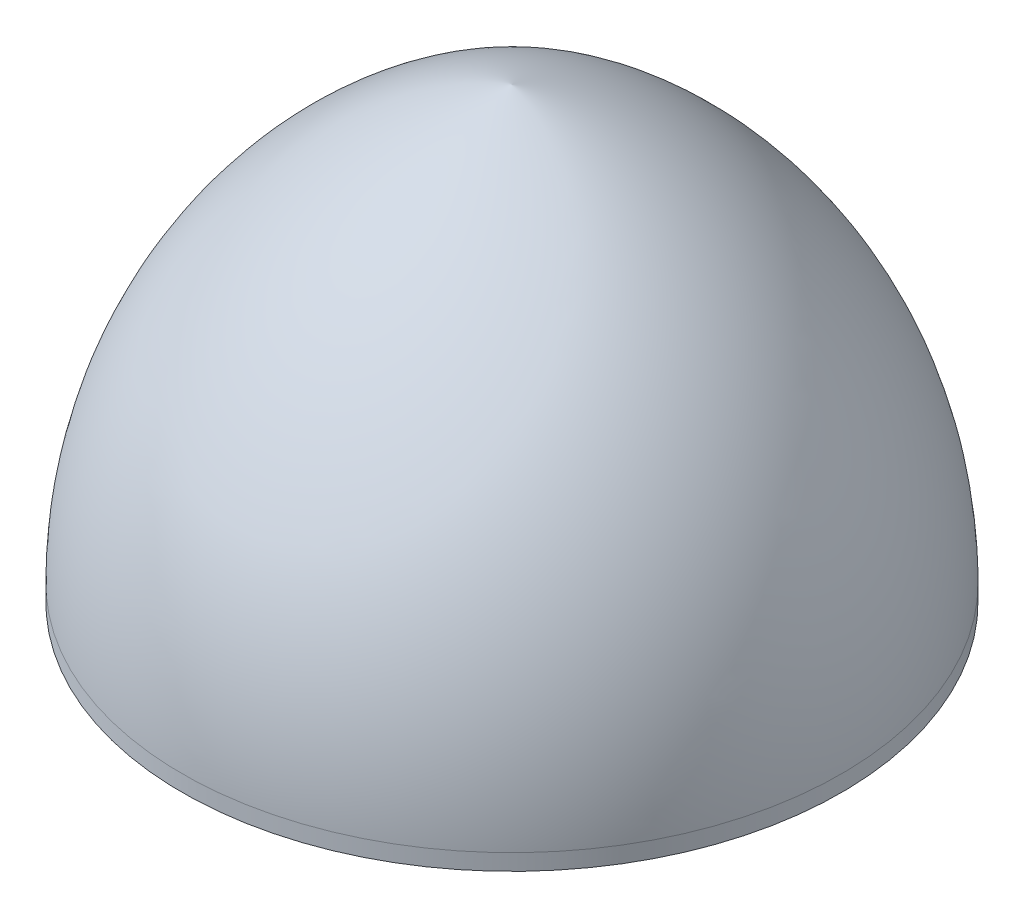
ISO-10303-21;
HEADER;
FILE_DESCRIPTION(('STEP AP214'),'2;1');
FILE_NAME('part.step','',(''),(''),'','','');
FILE_SCHEMA(('AUTOMOTIVE_DESIGN { 1 0 10303 214 1 1 1 1 }'));
ENDSEC;
DATA;
#1=APPLICATION_CONTEXT('core data for automotive mechanical design processes');
#2=APPLICATION_PROTOCOL_DEFINITION('international standard','automotive_design',2000,#1);
#3=PRODUCT_CONTEXT('',#1,'mechanical');
#4=PRODUCT('Part','Part','',(#3));
#5=PRODUCT_RELATED_PRODUCT_CATEGORY('part','',(#4));
#6=PRODUCT_DEFINITION_FORMATION('','',#4);
#7=PRODUCT_DEFINITION_CONTEXT('part definition',#1,'design');
#8=PRODUCT_DEFINITION('design','',#6,#7);
#9=PRODUCT_DEFINITION_SHAPE('','',#8);
#10=(LENGTH_UNIT() NAMED_UNIT(*) SI_UNIT(.MILLI.,.METRE.));
#11=(NAMED_UNIT(*) PLANE_ANGLE_UNIT() SI_UNIT($,.RADIAN.));
#12=(NAMED_UNIT(*) SI_UNIT($,.STERADIAN.) SOLID_ANGLE_UNIT());
#13=UNCERTAINTY_MEASURE_WITH_UNIT(LENGTH_MEASURE(1.E-05),#10,'distance_accuracy_value','');
#14=(GEOMETRIC_REPRESENTATION_CONTEXT(3) GLOBAL_UNCERTAINTY_ASSIGNED_CONTEXT((#13)) GLOBAL_UNIT_ASSIGNED_CONTEXT((#10,
#11,#12)) REPRESENTATION_CONTEXT('',''));
#15=CARTESIAN_POINT('',(0.,0.,0.));
#16=DIRECTION('',(0.,0.,1.));
#17=DIRECTION('',(1.,0.,0.));
#18=AXIS2_PLACEMENT_3D('',#15,#16,#17);
#19=CARTESIAN_POINT('',(0.,0.,0.));
#20=DIRECTION('',(0.,-1.,0.));
#21=DIRECTION('',(0.,0.,-1.));
#22=AXIS2_PLACEMENT_3D('',#19,#20,#21);
#23=CYLINDRICAL_SURFACE('',#22,58.);
#24=CARTESIAN_POINT('',(0.,170.,0.));
#25=DIRECTION('',(0.,-1.,0.));
#26=DIRECTION('',(0.,0.,-1.));
#27=AXIS2_PLACEMENT_3D('',#24,#25,#26);
#28=CIRCLE('',#27,58.);
#29=CARTESIAN_POINT('',(-58.,170.,0.));
#30=VERTEX_POINT('',#29);
#31=CARTESIAN_POINT('',(57.9205130157653,170.,-3.03548546209075));
#32=VERTEX_POINT('',#31);
#33=EDGE_CURVE('E44',#30,#32,#28,.T.);
#34=ORIENTED_EDGE('',*,*,#33,.F.);
#35=DIRECTION('',(0.,1.,0.));
#36=VECTOR('',#35,1.);
#37=CARTESIAN_POINT('',(-58.,0.,0.));
#38=LINE('',#37,#36);
#39=CARTESIAN_POINT('',(-58.,167.,0.));
#40=VERTEX_POINT('',#39);
#41=EDGE_CURVE('E199',#40,#30,#38,.T.);
#42=ORIENTED_EDGE('',*,*,#41,.F.);
#43=CARTESIAN_POINT('',(0.,167.,0.));
#44=DIRECTION('',(0.,-1.,0.));
#45=DIRECTION('',(0.,0.,-1.));
#46=AXIS2_PLACEMENT_3D('',#43,#44,#45);
#47=CIRCLE('',#46,58.);
#48=CARTESIAN_POINT('',(57.9205130157653,167.,-3.03548546209075));
#49=VERTEX_POINT('',#48);
#50=EDGE_CURVE('E137',#40,#49,#47,.T.);
#51=ORIENTED_EDGE('',*,*,#50,.T.);
#52=DIRECTION('',(0.,1.,0.));
#53=VECTOR('',#52,1.);
#54=CARTESIAN_POINT('',(57.9205130157653,0.,-3.03548546209075));
#55=LINE('',#54,#53);
#56=EDGE_CURVE('E222',#49,#32,#55,.T.);
#57=ORIENTED_EDGE('',*,*,#56,.T.);
#58=EDGE_LOOP('',(#34,#42,#51,#57));
#59=FACE_BOUND('',#58,.T.);
#60=ADVANCED_FACE('F35',(#59),#23,.F.);
#61=DIRECTION('',(0.,1.,0.));
#62=VECTOR('',#61,1.);
#63=CARTESIAN_POINT('',(-57.9205130157653,0.,3.03548546209075));
#64=LINE('',#63,#62);
#65=CARTESIAN_POINT('',(-57.9205130157653,167.,3.03548546209075));
#66=VERTEX_POINT('',#65);
#67=CARTESIAN_POINT('',(-57.9205130157653,170.,3.03548546209075));
#68=VERTEX_POINT('',#67);
#69=EDGE_CURVE('E58',#66,#68,#64,.T.);
#70=ORIENTED_EDGE('',*,*,#69,.T.);
#71=CARTESIAN_POINT('',(58.,170.,0.));
#72=VERTEX_POINT('',#71);
#73=EDGE_CURVE('E43',#72,#68,#28,.T.);
#74=ORIENTED_EDGE('',*,*,#73,.F.);
#75=DIRECTION('',(0.,1.,0.));
#76=VECTOR('',#75,1.);
#77=CARTESIAN_POINT('',(58.,0.,0.));
#78=LINE('',#77,#76);
#79=CARTESIAN_POINT('',(58.,167.,0.));
#80=VERTEX_POINT('',#79);
#81=EDGE_CURVE('E215',#80,#72,#78,.T.);
#82=ORIENTED_EDGE('',*,*,#81,.F.);
#83=EDGE_CURVE('E234',#80,#66,#47,.T.);
#84=ORIENTED_EDGE('',*,*,#83,.T.);
#85=EDGE_LOOP('',(#70,#74,#82,#84));
#86=FACE_BOUND('',#85,.T.);
#87=ADVANCED_FACE('F250',(#86),#23,.F.);
#88=CARTESIAN_POINT('',(0.,170.,21.9590163934426));
#89=DIRECTION('',(-1.,0.,0.));
#90=DIRECTION('',(0.,0.,-1.));
#91=AXIS2_PLACEMENT_3D('',#88,#89,#90);
#92=CIRCLE('',#91,79.9590163934426);
#93=TRIMMED_CURVE('',#92,(PARAMETER_VALUE(-1.29259310940795)),
(PARAMETER_VALUE(1.29259310940795)),.T.,.PARAMETER.);
#94=CARTESIAN_POINT('',(0.,170.,0.));
#95=DIRECTION('',(0.,-1.,0.));
#96=AXIS1_PLACEMENT('',#94,#95);
#97=SURFACE_OF_REVOLUTION('',#93,#96);
#98=CARTESIAN_POINT('',(0.,246.884627212723,0.));
#99=VERTEX_POINT('',#98);
#100=VERTEX_LOOP('',#99);
#101=FACE_BOUND('',#100,.T.);
#102=EDGE_CURVE('E11',#32,#72,#28,.T.);
#103=ORIENTED_EDGE('',*,*,#102,.T.);
#104=ORIENTED_EDGE('',*,*,#73,.T.);
#105=CARTESIAN_POINT('',(0.,170.,0.));
#106=DIRECTION('',(0.,-1.,0.));
#107=DIRECTION('',(0.,0.,-1.));
#108=AXIS2_PLACEMENT_3D('',#105,#106,#107);
#109=CIRCLE('',#108,58.);
#110=EDGE_CURVE('E210',#68,#30,#109,.T.);
#111=ORIENTED_EDGE('',*,*,#110,.T.);
#112=ORIENTED_EDGE('',*,*,#33,.T.);
#113=EDGE_LOOP('',(#103,#104,#111,#112));
#114=FACE_BOUND('',#113,.T.);
#115=ADVANCED_FACE('F37',(#101,#114),#97,.F.);
#116=CARTESIAN_POINT('',(58.,167.,0.));
#117=DIRECTION('',(0.,-1.,0.));
#118=DIRECTION('',(0.,0.,-1.));
#119=AXIS2_PLACEMENT_3D('',#116,#117,#118);
#120=PLANE('',#119);
#121=CARTESIAN_POINT('',(0.,167.,0.));
#122=DIRECTION('',(0.,-1.,0.));
#123=DIRECTION('',(0.,0.,-1.));
#124=AXIS2_PLACEMENT_3D('',#121,#122,#123);
#125=CIRCLE('',#124,61.);
#126=CARTESIAN_POINT('',(0.,167.,-61.));
#127=VERTEX_POINT('',#126);
#128=EDGE_CURVE('E232',#127,#127,#125,.T.);
#129=ORIENTED_EDGE('',*,*,#128,.T.);
#130=EDGE_LOOP('',(#129));
#131=FACE_BOUND('',#130,.T.);
#132=ORIENTED_EDGE('',*,*,#83,.F.);
#133=DIRECTION('',(1.,0.,0.));
#134=VECTOR('',#133,1.);
#135=CARTESIAN_POINT('',(0.,167.,0.));
#136=LINE('',#135,#134);
#137=CARTESIAN_POINT('',(49.,167.,0.));
#138=VERTEX_POINT('',#137);
#139=EDGE_CURVE('E212',#138,#80,#136,.T.);
#140=ORIENTED_EDGE('',*,*,#139,.F.);
#141=CARTESIAN_POINT('',(0.,167.,0.));
#142=DIRECTION('',(0.,-1.,0.));
#143=DIRECTION('',(0.,0.,-1.));
#144=AXIS2_PLACEMENT_3D('',#141,#142,#143);
#145=CIRCLE('',#144,49.);
#146=CARTESIAN_POINT('',(47.3303654881643,167.,-12.6821332100235));
#147=VERTEX_POINT('',#146);
#148=EDGE_CURVE('E188',#147,#138,#145,.T.);
#149=ORIENTED_EDGE('',*,*,#148,.F.);
#150=DIRECTION('',(0.965925826289068,0.,-0.258819045102521));
#151=VECTOR('',#150,1.);
#152=CARTESIAN_POINT('',(0.,167.,0.));
#153=LINE('',#152,#151);
#154=CARTESIAN_POINT('',(50.2281429670316,167.,-13.4585903453311));
#155=VERTEX_POINT('',#154);
#156=EDGE_CURVE('E176',#147,#155,#153,.T.);
#157=ORIENTED_EDGE('',*,*,#156,.T.);
#158=CARTESIAN_POINT('',(0.,167.,0.));
#159=DIRECTION('',(0.,-1.,0.));
#160=DIRECTION('',(0.,0.,-1.));
#161=AXIS2_PLACEMENT_3D('',#158,#159,#160);
#162=CIRCLE('',#161,52.);
#163=CARTESIAN_POINT('',(51.9287358072378,167.,-2.72146972463309));
#164=VERTEX_POINT('',#163);
#165=EDGE_CURVE('E142',#155,#164,#162,.T.);
#166=ORIENTED_EDGE('',*,*,#165,.T.);
#167=DIRECTION('',(0.998629534754574,0.,-0.0523359562429439));
#168=VECTOR('',#167,1.);
#169=CARTESIAN_POINT('',(0.,167.,0.));
#170=LINE('',#169,#168);
#171=EDGE_CURVE('E220',#164,#49,#170,.T.);
#172=ORIENTED_EDGE('',*,*,#171,.T.);
#173=ORIENTED_EDGE('',*,*,#50,.F.);
#174=DIRECTION('',(-1.,0.,0.));
#175=VECTOR('',#174,1.);
#176=CARTESIAN_POINT('',(0.,167.,0.));
#177=LINE('',#176,#175);
#178=CARTESIAN_POINT('',(-49.,167.,0.));
#179=VERTEX_POINT('',#178);
#180=EDGE_CURVE('E130',#179,#40,#177,.T.);
#181=ORIENTED_EDGE('',*,*,#180,.F.);
#182=CARTESIAN_POINT('',(0.,167.,0.));
#183=DIRECTION('',(0.,-1.,0.));
#184=DIRECTION('',(0.,0.,-1.));
#185=AXIS2_PLACEMENT_3D('',#182,#183,#184);
#186=CIRCLE('',#185,49.);
#187=CARTESIAN_POINT('',(-47.3303654881643,167.,12.6821332100235));
#188=VERTEX_POINT('',#187);
#189=EDGE_CURVE('E134',#188,#179,#186,.T.);
#190=ORIENTED_EDGE('',*,*,#189,.F.);
#191=DIRECTION('',(-0.965925826289068,0.,0.258819045102521));
#192=VECTOR('',#191,1.);
#193=CARTESIAN_POINT('',(0.,167.,0.));
#194=LINE('',#193,#192);
#195=CARTESIAN_POINT('',(-50.2281429670315,167.,13.4585903453311));
#196=VERTEX_POINT('',#195);
#197=EDGE_CURVE('E157',#188,#196,#194,.T.);
#198=ORIENTED_EDGE('',*,*,#197,.T.);
#199=CARTESIAN_POINT('',(0.,167.,0.));
#200=DIRECTION('',(0.,-1.,0.));
#201=DIRECTION('',(0.,0.,-1.));
#202=AXIS2_PLACEMENT_3D('',#199,#200,#201);
#203=CIRCLE('',#202,52.);
#204=CARTESIAN_POINT('',(-51.9287358072378,167.,2.72146972463308));
#205=VERTEX_POINT('',#204);
#206=EDGE_CURVE('E168',#196,#205,#203,.T.);
#207=ORIENTED_EDGE('',*,*,#206,.T.);
#208=DIRECTION('',(-0.998629534754574,0.,0.0523359562429439));
#209=VECTOR('',#208,1.);
#210=CARTESIAN_POINT('',(0.,167.,0.));
#211=LINE('',#210,#209);
#212=EDGE_CURVE('E201',#205,#66,#211,.T.);
#213=ORIENTED_EDGE('',*,*,#212,.T.);
#214=EDGE_LOOP('',(#132,#140,#149,#157,#166,#172,#173,#181,#190,#198,#207,#213));
#215=FACE_BOUND('',#214,.T.);
#216=ADVANCED_FACE('F132',(#131,#215),#120,.T.);
#217=CARTESIAN_POINT('',(0.,0.,0.));
#218=DIRECTION('',(0.,-1.,0.));
#219=DIRECTION('',(0.,0.,-1.));
#220=AXIS2_PLACEMENT_3D('',#217,#218,#219);
#221=CYLINDRICAL_SURFACE('',#220,61.);
#222=ORIENTED_EDGE('',*,*,#128,.F.);
#223=EDGE_LOOP('',(#222));
#224=FACE_BOUND('',#223,.T.);
#225=CARTESIAN_POINT('',(0.,170.,0.));
#226=DIRECTION('',(0.,-1.,0.));
#227=DIRECTION('',(0.,0.,-1.));
#228=AXIS2_PLACEMENT_3D('',#225,#226,#227);
#229=CIRCLE('',#228,61.);
#230=CARTESIAN_POINT('',(0.,170.,-61.));
#231=VERTEX_POINT('',#230);
#232=EDGE_CURVE('E229',#231,#231,#229,.T.);
#233=ORIENTED_EDGE('',*,*,#232,.T.);
#234=EDGE_LOOP('',(#233));
#235=FACE_BOUND('',#234,.T.);
#236=ADVANCED_FACE('F260',(#224,#235),#221,.T.);
#237=CARTESIAN_POINT('',(0.,170.,21.9590163934426));
#238=DIRECTION('',(-1.,0.,0.));
#239=DIRECTION('',(0.,0.,-1.));
#240=AXIS2_PLACEMENT_3D('',#237,#238,#239);
#241=CIRCLE('',#240,82.9590163934426);
#242=TRIMMED_CURVE('',#241,(PARAMETER_VALUE(-1.30290645490157)),
(PARAMETER_VALUE(1.30290645490157)),.T.,.PARAMETER.);
#243=CARTESIAN_POINT('',(0.,170.,0.));
#244=DIRECTION('',(0.,-1.,0.));
#245=AXIS1_PLACEMENT('',#243,#244);
#246=SURFACE_OF_REVOLUTION('',#242,#245);
#247=CARTESIAN_POINT('',(0.,250.,0.));
#248=VERTEX_POINT('',#247);
#249=VERTEX_LOOP('',#248);
#250=FACE_BOUND('',#249,.T.);
#251=ORIENTED_EDGE('',*,*,#232,.F.);
#252=EDGE_LOOP('',(#251));
#253=FACE_BOUND('',#252,.T.);
#254=ADVANCED_FACE('F264',(#250,#253),#246,.T.);
#255=CARTESIAN_POINT('',(0.,170.,0.));
#256=DIRECTION('',(0.,1.,0.));
#257=DIRECTION('',(0.,0.,1.));
#258=AXIS2_PLACEMENT_3D('',#255,#256,#257);
#259=PLANE('',#258);
#260=DIRECTION('',(-0.998629534754574,0.,0.0523359562429439));
#261=VECTOR('',#260,1.);
#262=CARTESIAN_POINT('',(0.,170.,0.));
#263=LINE('',#262,#261);
#264=CARTESIAN_POINT('',(51.9287358072379,170.,-2.72146972463309));
#265=VERTEX_POINT('',#264);
#266=EDGE_CURVE('E224',#32,#265,#263,.T.);
#267=ORIENTED_EDGE('',*,*,#266,.T.);
#268=CARTESIAN_POINT('',(0.,170.,0.));
#269=DIRECTION('',(0.,-1.,0.));
#270=DIRECTION('',(0.,0.,-1.));
#271=AXIS2_PLACEMENT_3D('',#268,#269,#270);
#272=CIRCLE('',#271,52.);
#273=CARTESIAN_POINT('',(50.2281429670316,170.,-13.4585903453311));
#274=VERTEX_POINT('',#273);
#275=EDGE_CURVE('E194',#274,#265,#272,.T.);
#276=ORIENTED_EDGE('',*,*,#275,.F.);
#277=DIRECTION('',(-0.965925826289068,0.,0.258819045102521));
#278=VECTOR('',#277,1.);
#279=CARTESIAN_POINT('',(0.,170.,0.));
#280=LINE('',#279,#278);
#281=CARTESIAN_POINT('',(47.3303654881643,170.,-12.6821332100235));
#282=VERTEX_POINT('',#281);
#283=EDGE_CURVE('E182',#274,#282,#280,.T.);
#284=ORIENTED_EDGE('',*,*,#283,.T.);
#285=CARTESIAN_POINT('',(0.,170.,0.));
#286=DIRECTION('',(0.,-1.,0.));
#287=DIRECTION('',(0.,0.,-1.));
#288=AXIS2_PLACEMENT_3D('',#285,#286,#287);
#289=CIRCLE('',#288,49.);
#290=CARTESIAN_POINT('',(49.,170.,0.));
#291=VERTEX_POINT('',#290);
#292=EDGE_CURVE('E191',#282,#291,#289,.T.);
#293=ORIENTED_EDGE('',*,*,#292,.T.);
#294=DIRECTION('',(-1.,0.,0.));
#295=VECTOR('',#294,1.);
#296=CARTESIAN_POINT('',(0.,170.,0.));
#297=LINE('',#296,#295);
#298=EDGE_CURVE('E218',#72,#291,#297,.T.);
#299=ORIENTED_EDGE('',*,*,#298,.F.);
#300=ORIENTED_EDGE('',*,*,#102,.F.);
#301=EDGE_LOOP('',(#267,#276,#284,#293,#299,#300));
#302=FACE_BOUND('',#301,.T.);
#303=ADVANCED_FACE('F244',(#302),#259,.T.);
#304=CARTESIAN_POINT('',(0.,0.,0.));
#305=DIRECTION('',(0.0523359562429439,0.,0.998629534754574));
#306=DIRECTION('',(0.998629534754574,0.,-0.0523359562429439));
#307=AXIS2_PLACEMENT_3D('',#304,#305,#306);
#308=PLANE('',#307);
#309=ORIENTED_EDGE('',*,*,#171,.F.);
#310=DIRECTION('',(0.,-1.,0.));
#311=VECTOR('',#310,1.);
#312=CARTESIAN_POINT('',(51.9287358072382,1.20274161001059E-13,-2.72146972463311));
#313=LINE('',#312,#311);
#314=EDGE_CURVE('E227',#265,#164,#313,.T.);
#315=ORIENTED_EDGE('',*,*,#314,.F.);
#316=ORIENTED_EDGE('',*,*,#266,.F.);
#317=ORIENTED_EDGE('',*,*,#56,.F.);
#318=EDGE_LOOP('',(#309,#315,#316,#317));
#319=FACE_BOUND('',#318,.T.);
#320=ADVANCED_FACE('F242',(#319),#308,.F.);
#321=CARTESIAN_POINT('',(0.,0.,0.));
#322=DIRECTION('',(0.,0.,1.));
#323=DIRECTION('',(1.,0.,0.));
#324=AXIS2_PLACEMENT_3D('',#321,#322,#323);
#325=PLANE('',#324);
#326=ORIENTED_EDGE('',*,*,#139,.T.);
#327=ORIENTED_EDGE('',*,*,#81,.T.);
#328=ORIENTED_EDGE('',*,*,#298,.T.);
#329=DIRECTION('',(0.,-1.,0.));
#330=VECTOR('',#329,1.);
#331=CARTESIAN_POINT('',(49.,0.,0.));
#332=LINE('',#331,#330);
#333=EDGE_CURVE('E151',#291,#138,#332,.T.);
#334=ORIENTED_EDGE('',*,*,#333,.T.);
#335=EDGE_LOOP('',(#326,#327,#328,#334));
#336=FACE_BOUND('',#335,.T.);
#337=ADVANCED_FACE('F249',(#336),#325,.T.);
#338=CARTESIAN_POINT('',(0.,170.,0.));
#339=DIRECTION('',(0.,1.,0.));
#340=DIRECTION('',(0.,0.,1.));
#341=AXIS2_PLACEMENT_3D('',#338,#339,#340);
#342=PLANE('',#341);
#343=ORIENTED_EDGE('',*,*,#110,.F.);
#344=DIRECTION('',(0.998629534754574,0.,-0.0523359562429439));
#345=VECTOR('',#344,1.);
#346=CARTESIAN_POINT('',(0.,170.,0.));
#347=LINE('',#346,#345);
#348=CARTESIAN_POINT('',(-51.9287358072378,170.,2.72146972463308));
#349=VERTEX_POINT('',#348);
#350=EDGE_CURVE('E206',#68,#349,#347,.T.);
#351=ORIENTED_EDGE('',*,*,#350,.T.);
#352=CARTESIAN_POINT('',(0.,170.,0.));
#353=DIRECTION('',(0.,-1.,0.));
#354=DIRECTION('',(0.,0.,-1.));
#355=AXIS2_PLACEMENT_3D('',#352,#353,#354);
#356=CIRCLE('',#355,52.);
#357=CARTESIAN_POINT('',(-50.2281429670315,170.,13.4585903453311));
#358=VERTEX_POINT('',#357);
#359=EDGE_CURVE('E171',#358,#349,#356,.T.);
#360=ORIENTED_EDGE('',*,*,#359,.F.);
#361=DIRECTION('',(0.965925826289068,0.,-0.258819045102521));
#362=VECTOR('',#361,1.);
#363=CARTESIAN_POINT('',(1.13941766070283E-12,170.,-3.05306042027084E-13));
#364=LINE('',#363,#362);
#365=CARTESIAN_POINT('',(-47.3303654881643,170.,12.6821332100235));
#366=VERTEX_POINT('',#365);
#367=EDGE_CURVE('E162',#358,#366,#364,.T.);
#368=ORIENTED_EDGE('',*,*,#367,.T.);
#369=CARTESIAN_POINT('',(0.,170.,0.));
#370=DIRECTION('',(0.,-1.,0.));
#371=DIRECTION('',(0.,0.,-1.));
#372=AXIS2_PLACEMENT_3D('',#369,#370,#371);
#373=CIRCLE('',#372,49.);
#374=CARTESIAN_POINT('',(-49.,170.,0.));
#375=VERTEX_POINT('',#374);
#376=EDGE_CURVE('E152',#366,#375,#373,.T.);
#377=ORIENTED_EDGE('',*,*,#376,.T.);
#378=DIRECTION('',(1.,0.,0.));
#379=VECTOR('',#378,1.);
#380=CARTESIAN_POINT('',(0.,170.,0.));
#381=LINE('',#380,#379);
#382=EDGE_CURVE('E141',#30,#375,#381,.T.);
#383=ORIENTED_EDGE('',*,*,#382,.F.);
#384=EDGE_LOOP('',(#343,#351,#360,#368,#377,#383));
#385=FACE_BOUND('',#384,.T.);
#386=ADVANCED_FACE('F275',(#385),#342,.T.);
#387=CARTESIAN_POINT('',(0.,0.,0.));
#388=DIRECTION('',(0.0523359562429439,0.,0.998629534754574));
#389=DIRECTION('',(0.998629534754574,0.,-0.0523359562429439));
#390=AXIS2_PLACEMENT_3D('',#387,#388,#389);
#391=PLANE('',#390);
#392=ORIENTED_EDGE('',*,*,#212,.F.);
#393=DIRECTION('',(0.,-1.,0.));
#394=VECTOR('',#393,1.);
#395=CARTESIAN_POINT('',(-51.9287358072382,1.20274161001059E-13,2.72146972463311));
#396=LINE('',#395,#394);
#397=EDGE_CURVE('E204',#349,#205,#396,.T.);
#398=ORIENTED_EDGE('',*,*,#397,.F.);
#399=ORIENTED_EDGE('',*,*,#350,.F.);
#400=ORIENTED_EDGE('',*,*,#69,.F.);
#401=EDGE_LOOP('',(#392,#398,#399,#400));
#402=FACE_BOUND('',#401,.T.);
#403=ADVANCED_FACE('F278',(#402),#391,.T.);
#404=CARTESIAN_POINT('',(0.,0.,0.));
#405=DIRECTION('',(0.,0.,1.));
#406=DIRECTION('',(1.,0.,0.));
#407=AXIS2_PLACEMENT_3D('',#404,#405,#406);
#408=PLANE('',#407);
#409=ORIENTED_EDGE('',*,*,#180,.T.);
#410=ORIENTED_EDGE('',*,*,#41,.T.);
#411=ORIENTED_EDGE('',*,*,#382,.T.);
#412=DIRECTION('',(0.,-1.,0.));
#413=VECTOR('',#412,1.);
#414=CARTESIAN_POINT('',(-49.,0.,0.));
#415=LINE('',#414,#413);
#416=EDGE_CURVE('E148',#375,#179,#415,.T.);
#417=ORIENTED_EDGE('',*,*,#416,.T.);
#418=EDGE_LOOP('',(#409,#410,#411,#417));
#419=FACE_BOUND('',#418,.T.);
#420=ADVANCED_FACE('F154',(#419),#408,.F.);
#421=CARTESIAN_POINT('',(0.,250.,0.));
#422=DIRECTION('',(0.,-1.,0.));
#423=DIRECTION('',(0.,0.,-1.));
#424=AXIS2_PLACEMENT_3D('',#421,#422,#423);
#425=CYLINDRICAL_SURFACE('',#424,52.);
#426=ORIENTED_EDGE('',*,*,#314,.T.);
#427=ORIENTED_EDGE('',*,*,#165,.F.);
#428=DIRECTION('',(0.,1.,0.));
#429=VECTOR('',#428,1.);
#430=CARTESIAN_POINT('',(50.2281429670316,0.,-13.4585903453311));
#431=LINE('',#430,#429);
#432=EDGE_CURVE('E179',#155,#274,#431,.T.);
#433=ORIENTED_EDGE('',*,*,#432,.T.);
#434=ORIENTED_EDGE('',*,*,#275,.T.);
#435=EDGE_LOOP('',(#426,#427,#433,#434));
#436=FACE_BOUND('',#435,.T.);
#437=ADVANCED_FACE('F285',(#436),#425,.T.);
#438=CARTESIAN_POINT('',(0.,250.,0.));
#439=DIRECTION('',(0.,-1.,0.));
#440=DIRECTION('',(0.,0.,-1.));
#441=AXIS2_PLACEMENT_3D('',#438,#439,#440);
#442=CYLINDRICAL_SURFACE('',#441,49.);
#443=DIRECTION('',(0.,-1.,0.));
#444=VECTOR('',#443,1.);
#445=CARTESIAN_POINT('',(47.3303654881643,0.,-12.6821332100235));
#446=LINE('',#445,#444);
#447=EDGE_CURVE('E185',#282,#147,#446,.T.);
#448=ORIENTED_EDGE('',*,*,#447,.T.);
#449=ORIENTED_EDGE('',*,*,#148,.T.);
#450=ORIENTED_EDGE('',*,*,#333,.F.);
#451=ORIENTED_EDGE('',*,*,#292,.F.);
#452=EDGE_LOOP('',(#448,#449,#450,#451));
#453=FACE_BOUND('',#452,.T.);
#454=ADVANCED_FACE('F288',(#453),#442,.F.);
#455=CARTESIAN_POINT('',(0.,0.,0.));
#456=DIRECTION('',(0.258819045102521,0.,0.965925826289068));
#457=DIRECTION('',(0.965925826289068,0.,-0.258819045102521));
#458=AXIS2_PLACEMENT_3D('',#455,#456,#457);
#459=PLANE('',#458);
#460=ORIENTED_EDGE('',*,*,#156,.F.);
#461=ORIENTED_EDGE('',*,*,#447,.F.);
#462=ORIENTED_EDGE('',*,*,#283,.F.);
#463=ORIENTED_EDGE('',*,*,#432,.F.);
#464=EDGE_LOOP('',(#460,#461,#462,#463));
#465=FACE_BOUND('',#464,.T.);
#466=ADVANCED_FACE('F292',(#465),#459,.F.);
#467=CARTESIAN_POINT('',(0.,250.,0.));
#468=DIRECTION('',(0.,-1.,0.));
#469=DIRECTION('',(0.,0.,-1.));
#470=AXIS2_PLACEMENT_3D('',#467,#468,#469);
#471=CYLINDRICAL_SURFACE('',#470,49.);
#472=ORIENTED_EDGE('',*,*,#376,.F.);
#473=DIRECTION('',(0.,-1.,0.));
#474=VECTOR('',#473,1.);
#475=CARTESIAN_POINT('',(-47.3303654881643,0.,12.6821332100235));
#476=LINE('',#475,#474);
#477=EDGE_CURVE('E150',#366,#188,#476,.T.);
#478=ORIENTED_EDGE('',*,*,#477,.T.);
#479=ORIENTED_EDGE('',*,*,#189,.T.);
#480=ORIENTED_EDGE('',*,*,#416,.F.);
#481=EDGE_LOOP('',(#472,#478,#479,#480));
#482=FACE_BOUND('',#481,.T.);
#483=ADVANCED_FACE('F147',(#482),#471,.F.);
#484=CARTESIAN_POINT('',(0.,250.,0.));
#485=DIRECTION('',(0.,-1.,0.));
#486=DIRECTION('',(0.,0.,-1.));
#487=AXIS2_PLACEMENT_3D('',#484,#485,#486);
#488=CYLINDRICAL_SURFACE('',#487,52.);
#489=ORIENTED_EDGE('',*,*,#359,.T.);
#490=ORIENTED_EDGE('',*,*,#397,.T.);
#491=ORIENTED_EDGE('',*,*,#206,.F.);
#492=DIRECTION('',(0.,1.,0.));
#493=VECTOR('',#492,1.);
#494=CARTESIAN_POINT('',(-50.2281429670315,0.,13.4585903453311));
#495=LINE('',#494,#493);
#496=EDGE_CURVE('E165',#196,#358,#495,.T.);
#497=ORIENTED_EDGE('',*,*,#496,.T.);
#498=EDGE_LOOP('',(#489,#490,#491,#497));
#499=FACE_BOUND('',#498,.T.);
#500=ADVANCED_FACE('F299',(#499),#488,.T.);
#501=CARTESIAN_POINT('',(0.,0.,0.));
#502=DIRECTION('',(0.258819045102521,0.,0.965925826289068));
#503=DIRECTION('',(0.965925826289068,0.,-0.258819045102521));
#504=AXIS2_PLACEMENT_3D('',#501,#502,#503);
#505=PLANE('',#504);
#506=ORIENTED_EDGE('',*,*,#197,.F.);
#507=ORIENTED_EDGE('',*,*,#477,.F.);
#508=ORIENTED_EDGE('',*,*,#367,.F.);
#509=ORIENTED_EDGE('',*,*,#496,.F.);
#510=EDGE_LOOP('',(#506,#507,#508,#509));
#511=FACE_BOUND('',#510,.T.);
#512=ADVANCED_FACE('F302',(#511),#505,.T.);
#513=CLOSED_SHELL('',(#60,#87,#115,#216,#236,#254,#303,#320,#337,#386,#403,#420,#437,#454,#466,
#483,#500,#512));
#514=MANIFOLD_SOLID_BREP('B2',#513);
#515=ADVANCED_BREP_SHAPE_REPRESENTATION('',(#18,#514),#14);
#516=SHAPE_DEFINITION_REPRESENTATION(#9,#515);
ENDSEC;
END-ISO-10303-21;
